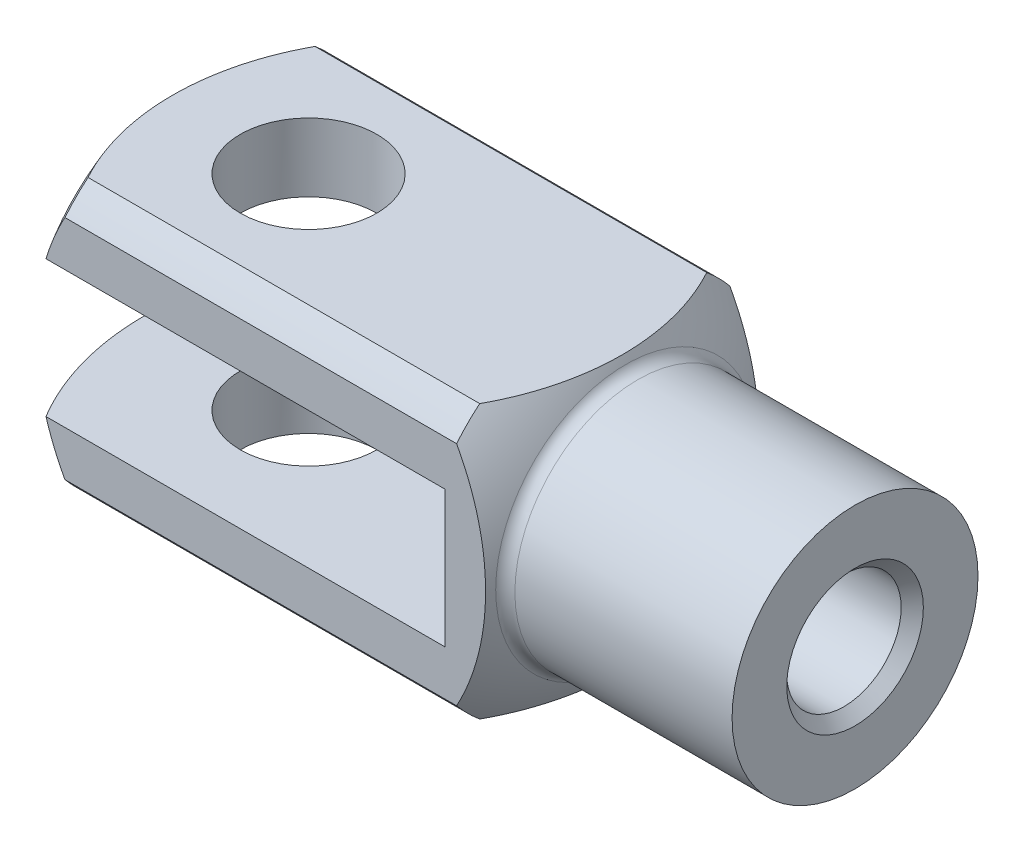
ISO-10303-21;
HEADER;
FILE_DESCRIPTION(('STEP AP214'),'2;1');
FILE_NAME('part.step','',(''),(''),'','','');
FILE_SCHEMA(('AUTOMOTIVE_DESIGN { 1 0 10303 214 1 1 1 1 }'));
ENDSEC;
DATA;
#1=APPLICATION_CONTEXT('core data for automotive mechanical design processes');
#2=APPLICATION_PROTOCOL_DEFINITION('international standard','automotive_design',2000,#1);
#3=PRODUCT_CONTEXT('',#1,'mechanical');
#4=PRODUCT('Part','Part','',(#3));
#5=PRODUCT_RELATED_PRODUCT_CATEGORY('part','',(#4));
#6=PRODUCT_DEFINITION_FORMATION('','',#4);
#7=PRODUCT_DEFINITION_CONTEXT('part definition',#1,'design');
#8=PRODUCT_DEFINITION('design','',#6,#7);
#9=PRODUCT_DEFINITION_SHAPE('','',#8);
#10=(LENGTH_UNIT() NAMED_UNIT(*) SI_UNIT(.MILLI.,.METRE.));
#11=(NAMED_UNIT(*) PLANE_ANGLE_UNIT() SI_UNIT($,.RADIAN.));
#12=(NAMED_UNIT(*) SI_UNIT($,.STERADIAN.) SOLID_ANGLE_UNIT());
#13=UNCERTAINTY_MEASURE_WITH_UNIT(LENGTH_MEASURE(1.E-05),#10,'distance_accuracy_value','');
#14=(GEOMETRIC_REPRESENTATION_CONTEXT(3) GLOBAL_UNCERTAINTY_ASSIGNED_CONTEXT((#13)) GLOBAL_UNIT_ASSIGNED_CONTEXT((#10,
#11,#12)) REPRESENTATION_CONTEXT('',''));
#15=CARTESIAN_POINT('',(0.,0.,0.));
#16=DIRECTION('',(0.,0.,1.));
#17=DIRECTION('',(1.,0.,0.));
#18=AXIS2_PLACEMENT_3D('',#15,#16,#17);
#19=CARTESIAN_POINT('',(-63.9,20.,-10.));
#20=DIRECTION('',(0.,0.,-1.));
#21=DIRECTION('',(-1.,0.,0.));
#22=AXIS2_PLACEMENT_3D('',#19,#20,#21);
#23=PLANE('',#22);
#24=DIRECTION('',(-1.,0.,0.));
#25=VECTOR('',#24,1.);
#26=CARTESIAN_POINT('',(20.,-5.,-10.));
#27=LINE('',#26,#25);
#28=CARTESIAN_POINT('',(20.,-5.,-10.));
#29=VERTEX_POINT('',#28);
#30=CARTESIAN_POINT('',(-9.21820722073961,-5.,-10.));
#31=VERTEX_POINT('',#30);
#32=EDGE_CURVE('E168',#29,#31,#27,.T.);
#33=ORIENTED_EDGE('',*,*,#32,.F.);
#34=DIRECTION('',(0.,-1.,0.));
#35=VECTOR('',#34,1.);
#36=CARTESIAN_POINT('',(20.,5.,-10.));
#37=LINE('',#36,#35);
#38=CARTESIAN_POINT('',(20.,5.,-10.));
#39=VERTEX_POINT('',#38);
#40=EDGE_CURVE('E152',#39,#29,#37,.T.);
#41=ORIENTED_EDGE('',*,*,#40,.F.);
#42=DIRECTION('',(-1.,0.,0.));
#43=VECTOR('',#42,1.);
#44=CARTESIAN_POINT('',(20.,5.,-10.));
#45=LINE('',#44,#43);
#46=CARTESIAN_POINT('',(-9.21820722073961,5.,-10.));
#47=VERTEX_POINT('',#46);
#48=EDGE_CURVE('E149',#39,#47,#45,.T.);
#49=ORIENTED_EDGE('',*,*,#48,.T.);
#50=CARTESIAN_POINT('',(7.36491673103307,1.37997252513955E-12,-10.));
#51=DIRECTION('',(0.,0.,1.));
#52=DIRECTION('',(-1.,0.,0.));
#53=AXIS2_PLACEMENT_3D('',#50,#51,#52);
#54=CIRCLE('',#53,17.3205080756842);
#55=CARTESIAN_POINT('',(-7.8337674225336,8.30662386291768,-10.));
#56=VERTEX_POINT('',#55);
#57=EDGE_CURVE('E880',#56,#47,#54,.T.);
#58=ORIENTED_EDGE('',*,*,#57,.F.);
#59=DIRECTION('',(1.,0.,0.));
#60=VECTOR('',#59,1.);
#61=CARTESIAN_POINT('',(40.,8.30662386291807,-10.));
#62=LINE('',#61,#60);
#63=CARTESIAN_POINT('',(20.833767422534,8.30662386291807,-10.));
#64=VERTEX_POINT('',#63);
#65=EDGE_CURVE('E1015',#56,#64,#62,.T.);
#66=ORIENTED_EDGE('',*,*,#65,.T.);
#67=CARTESIAN_POINT('',(5.63508326887225,-6.27987245538364E-11,-10.));
#68=DIRECTION('',(0.,0.,1.));
#69=DIRECTION('',(-1.,0.,0.));
#70=AXIS2_PLACEMENT_3D('',#67,#68,#69);
#71=CIRCLE('',#70,17.3205080758158);
#72=CARTESIAN_POINT('',(20.833767422534,-8.30662386291807,-10.));
#73=VERTEX_POINT('',#72);
#74=EDGE_CURVE('E440',#73,#64,#71,.T.);
#75=ORIENTED_EDGE('',*,*,#74,.F.);
#76=DIRECTION('',(-1.,0.,0.));
#77=VECTOR('',#76,1.);
#78=CARTESIAN_POINT('',(40.,-8.30662386291807,-10.));
#79=LINE('',#78,#77);
#80=CARTESIAN_POINT('',(-7.8337674225336,-8.3066238629163,-10.));
#81=VERTEX_POINT('',#80);
#82=EDGE_CURVE('E191',#73,#81,#79,.T.);
#83=ORIENTED_EDGE('',*,*,#82,.T.);
#84=EDGE_CURVE('E79',#31,#81,#54,.T.);
#85=ORIENTED_EDGE('',*,*,#84,.F.);
#86=EDGE_LOOP('',(#33,#41,#49,#58,#66,#75,#83,#85));
#87=FACE_BOUND('',#86,.T.);
#88=ADVANCED_FACE('F56',(#87),#23,.T.);
#89=CARTESIAN_POINT('',(40.,20.,10.));
#90=DIRECTION('',(0.,0.,1.));
#91=DIRECTION('',(1.,0.,0.));
#92=AXIS2_PLACEMENT_3D('',#89,#90,#91);
#93=PLANE('',#92);
#94=DIRECTION('',(-1.,0.,0.));
#95=VECTOR('',#94,1.);
#96=CARTESIAN_POINT('',(20.,-5.,10.));
#97=LINE('',#96,#95);
#98=CARTESIAN_POINT('',(20.,-5.,10.));
#99=VERTEX_POINT('',#98);
#100=CARTESIAN_POINT('',(-9.21820722073961,-5.,10.));
#101=VERTEX_POINT('',#100);
#102=EDGE_CURVE('E180',#99,#101,#97,.T.);
#103=ORIENTED_EDGE('',*,*,#102,.T.);
#104=CARTESIAN_POINT('',(7.36491673103307,1.37997252513955E-12,10.));
#105=DIRECTION('',(0.,0.,-1.));
#106=DIRECTION('',(1.,0.,0.));
#107=AXIS2_PLACEMENT_3D('',#104,#105,#106);
#108=CIRCLE('',#107,17.3205080756842);
#109=CARTESIAN_POINT('',(-7.8337674225336,-8.3066238629163,10.));
#110=VERTEX_POINT('',#109);
#111=EDGE_CURVE('E908',#110,#101,#108,.T.);
#112=ORIENTED_EDGE('',*,*,#111,.F.);
#113=DIRECTION('',(1.,0.,0.));
#114=VECTOR('',#113,1.);
#115=CARTESIAN_POINT('',(40.,-8.30662386291807,10.));
#116=LINE('',#115,#114);
#117=CARTESIAN_POINT('',(20.833767422534,-8.30662386291807,10.));
#118=VERTEX_POINT('',#117);
#119=EDGE_CURVE('E318',#110,#118,#116,.T.);
#120=ORIENTED_EDGE('',*,*,#119,.T.);
#121=CARTESIAN_POINT('',(5.63508326887225,-6.27987245538364E-11,10.));
#122=DIRECTION('',(0.,0.,-1.));
#123=DIRECTION('',(1.,0.,0.));
#124=AXIS2_PLACEMENT_3D('',#121,#122,#123);
#125=CIRCLE('',#124,17.3205080758158);
#126=CARTESIAN_POINT('',(20.833767422534,8.30662386291807,10.));
#127=VERTEX_POINT('',#126);
#128=EDGE_CURVE('E417',#127,#118,#125,.T.);
#129=ORIENTED_EDGE('',*,*,#128,.F.);
#130=DIRECTION('',(-1.,0.,0.));
#131=VECTOR('',#130,1.);
#132=CARTESIAN_POINT('',(40.,8.30662386291807,10.));
#133=LINE('',#132,#131);
#134=CARTESIAN_POINT('',(-7.8337674225336,8.30662386291768,10.));
#135=VERTEX_POINT('',#134);
#136=EDGE_CURVE('E1043',#127,#135,#133,.T.);
#137=ORIENTED_EDGE('',*,*,#136,.T.);
#138=CARTESIAN_POINT('',(-9.21820722073962,5.,10.));
#139=VERTEX_POINT('',#138);
#140=EDGE_CURVE('E166',#139,#135,#108,.T.);
#141=ORIENTED_EDGE('',*,*,#140,.F.);
#142=DIRECTION('',(-1.,0.,0.));
#143=VECTOR('',#142,1.);
#144=CARTESIAN_POINT('',(20.,5.,10.));
#145=LINE('',#144,#143);
#146=CARTESIAN_POINT('',(20.,5.,10.));
#147=VERTEX_POINT('',#146);
#148=EDGE_CURVE('E71',#147,#139,#145,.T.);
#149=ORIENTED_EDGE('',*,*,#148,.F.);
#150=DIRECTION('',(0.,1.,0.));
#151=VECTOR('',#150,1.);
#152=CARTESIAN_POINT('',(20.,-5.,10.));
#153=LINE('',#152,#151);
#154=EDGE_CURVE('E153',#99,#147,#153,.T.);
#155=ORIENTED_EDGE('',*,*,#154,.F.);
#156=EDGE_LOOP('',(#103,#112,#120,#129,#137,#141,#149,#155));
#157=FACE_BOUND('',#156,.T.);
#158=ADVANCED_FACE('F164',(#157),#93,.T.);
#159=CARTESIAN_POINT('',(7.36491673103307,1.37997252513955E-12,0.));
#160=DIRECTION('',(1.,0.,0.));
#161=DIRECTION('',(0.,-1.,0.));
#162=AXIS2_PLACEMENT_3D('',#159,#160,#161);
#163=SPHERICAL_SURFACE('',#162,19.999999999996);
#164=ORIENTED_EDGE('',*,*,#111,.T.);
#165=CARTESIAN_POINT('',(7.36491673103307,-5.,0.));
#166=DIRECTION('',(0.,-1.,0.));
#167=DIRECTION('',(0.,0.,1.));
#168=AXIS2_PLACEMENT_3D('',#165,#166,#167);
#169=CIRCLE('',#168,19.3649167310327);
#170=EDGE_CURVE('E294',#101,#31,#169,.T.);
#171=ORIENTED_EDGE('',*,*,#170,.T.);
#172=ORIENTED_EDGE('',*,*,#84,.T.);
#173=CARTESIAN_POINT('',(-7.8337674225336,0.,0.));
#174=DIRECTION('',(1.,0.,0.));
#175=DIRECTION('',(0.,0.,-1.));
#176=AXIS2_PLACEMENT_3D('',#173,#174,#175);
#177=CIRCLE('',#176,13.);
#178=CARTESIAN_POINT('',(-7.8337674225336,-10.,-8.30662386291807));
#179=VERTEX_POINT('',#178);
#180=EDGE_CURVE('E943',#179,#81,#177,.T.);
#181=ORIENTED_EDGE('',*,*,#180,.F.);
#182=CARTESIAN_POINT('',(7.36491673103307,-10.,0.));
#183=DIRECTION('',(0.,1.,0.));
#184=DIRECTION('',(0.,0.,-1.));
#185=AXIS2_PLACEMENT_3D('',#182,#183,#184);
#186=CIRCLE('',#185,17.3205080756835);
#187=CARTESIAN_POINT('',(-7.8337674225336,-10.,8.30662386291807));
#188=VERTEX_POINT('',#187);
#189=EDGE_CURVE('E953',#179,#188,#186,.T.);
#190=ORIENTED_EDGE('',*,*,#189,.T.);
#191=CARTESIAN_POINT('',(-7.8337674225336,0.,0.));
#192=DIRECTION('',(1.,0.,0.));
#193=DIRECTION('',(0.,0.,-1.));
#194=AXIS2_PLACEMENT_3D('',#191,#192,#193);
#195=CIRCLE('',#194,13.);
#196=EDGE_CURVE('E910',#110,#188,#195,.T.);
#197=ORIENTED_EDGE('',*,*,#196,.F.);
#198=EDGE_LOOP('',(#164,#171,#172,#181,#190,#197));
#199=FACE_BOUND('',#198,.T.);
#200=ADVANCED_FACE('F219',(#199),#163,.T.);
#201=ORIENTED_EDGE('',*,*,#57,.T.);
#202=CARTESIAN_POINT('',(7.36491673103307,5.,0.));
#203=DIRECTION('',(0.,1.,0.));
#204=DIRECTION('',(0.,0.,-1.));
#205=AXIS2_PLACEMENT_3D('',#202,#203,#204);
#206=CIRCLE('',#205,19.3649167310334);
#207=EDGE_CURVE('E184',#47,#139,#206,.T.);
#208=ORIENTED_EDGE('',*,*,#207,.T.);
#209=ORIENTED_EDGE('',*,*,#140,.T.);
#210=CARTESIAN_POINT('',(-7.8337674225336,0.,0.));
#211=DIRECTION('',(1.,0.,0.));
#212=DIRECTION('',(0.,0.,-1.));
#213=AXIS2_PLACEMENT_3D('',#210,#211,#212);
#214=CIRCLE('',#213,13.);
#215=CARTESIAN_POINT('',(-7.8337674225336,10.,8.30662386291807));
#216=VERTEX_POINT('',#215);
#217=EDGE_CURVE('E317',#216,#135,#214,.T.);
#218=ORIENTED_EDGE('',*,*,#217,.F.);
#219=CARTESIAN_POINT('',(7.36491673103307,10.,0.));
#220=DIRECTION('',(0.,-1.,0.));
#221=DIRECTION('',(0.,0.,1.));
#222=AXIS2_PLACEMENT_3D('',#219,#220,#221);
#223=CIRCLE('',#222,17.3205080756851);
#224=CARTESIAN_POINT('',(-7.8337674225336,10.,-8.30662386291807));
#225=VERTEX_POINT('',#224);
#226=EDGE_CURVE('E330',#216,#225,#223,.T.);
#227=ORIENTED_EDGE('',*,*,#226,.T.);
#228=CARTESIAN_POINT('',(-7.8337674225336,0.,0.));
#229=DIRECTION('',(1.,0.,0.));
#230=DIRECTION('',(0.,0.,-1.));
#231=AXIS2_PLACEMENT_3D('',#228,#229,#230);
#232=CIRCLE('',#231,13.);
#233=EDGE_CURVE('E341',#56,#225,#232,.T.);
#234=ORIENTED_EDGE('',*,*,#233,.F.);
#235=EDGE_LOOP('',(#201,#208,#209,#218,#227,#234));
#236=FACE_BOUND('',#235,.T.);
#237=ADVANCED_FACE('F230',(#236),#163,.T.);
#238=CARTESIAN_POINT('',(5.63508326887225,-6.27987245538364E-11,0.));
#239=DIRECTION('',(1.,0.,0.));
#240=DIRECTION('',(0.,0.,-1.));
#241=AXIS2_PLACEMENT_3D('',#238,#239,#240);
#242=SPHERICAL_SURFACE('',#241,20.0000000001101);
#243=CARTESIAN_POINT('',(23.2219264238721,-6.27987245538364E-11,0.));
#244=DIRECTION('',(-1.,0.,0.));
#245=DIRECTION('',(0.,0.,1.));
#246=AXIS2_PLACEMENT_3D('',#243,#244,#245);
#247=CIRCLE('',#246,9.52380952381113);
#248=CARTESIAN_POINT('',(23.2219264238721,-6.27987245538364E-11,9.52380952381113));
#249=VERTEX_POINT('',#248);
#250=EDGE_CURVE('E13',#249,#249,#247,.T.);
#251=ORIENTED_EDGE('',*,*,#250,.T.);
#252=EDGE_LOOP('',(#251));
#253=FACE_BOUND('',#252,.T.);
#254=CARTESIAN_POINT('',(20.833767422534,0.,0.));
#255=DIRECTION('',(1.,0.,0.));
#256=DIRECTION('',(0.,0.,-1.));
#257=AXIS2_PLACEMENT_3D('',#254,#255,#256);
#258=CIRCLE('',#257,13.);
#259=CARTESIAN_POINT('',(20.833767422534,10.,-8.30662386292942));
#260=VERTEX_POINT('',#259);
#261=EDGE_CURVE('E352',#64,#260,#258,.T.);
#262=ORIENTED_EDGE('',*,*,#261,.T.);
#263=CARTESIAN_POINT('',(5.63508326887225,10.,0.));
#264=DIRECTION('',(0.,-1.,0.));
#265=DIRECTION('',(0.,0.,1.));
#266=AXIS2_PLACEMENT_3D('',#263,#264,#265);
#267=CIRCLE('',#266,17.3205080757796);
#268=CARTESIAN_POINT('',(20.833767422534,10.,8.30662386292942));
#269=VERTEX_POINT('',#268);
#270=EDGE_CURVE('E390',#260,#269,#267,.T.);
#271=ORIENTED_EDGE('',*,*,#270,.T.);
#272=CARTESIAN_POINT('',(20.833767422534,0.,0.));
#273=DIRECTION('',(1.,0.,0.));
#274=DIRECTION('',(0.,0.,-1.));
#275=AXIS2_PLACEMENT_3D('',#272,#273,#274);
#276=CIRCLE('',#275,13.);
#277=EDGE_CURVE('E402',#269,#127,#276,.T.);
#278=ORIENTED_EDGE('',*,*,#277,.T.);
#279=ORIENTED_EDGE('',*,*,#128,.T.);
#280=CARTESIAN_POINT('',(20.833767422534,0.,0.));
#281=DIRECTION('',(1.,0.,0.));
#282=DIRECTION('',(0.,0.,-1.));
#283=AXIS2_PLACEMENT_3D('',#280,#281,#282);
#284=CIRCLE('',#283,13.);
#285=CARTESIAN_POINT('',(20.833767422534,-10.,8.30662386300502));
#286=VERTEX_POINT('',#285);
#287=EDGE_CURVE('E416',#118,#286,#284,.T.);
#288=ORIENTED_EDGE('',*,*,#287,.T.);
#289=CARTESIAN_POINT('',(5.63508326887225,-10.,0.));
#290=DIRECTION('',(0.,1.,0.));
#291=DIRECTION('',(0.,0.,-1.));
#292=AXIS2_PLACEMENT_3D('',#289,#290,#291);
#293=CIRCLE('',#292,17.3205080758521);
#294=CARTESIAN_POINT('',(20.833767422534,-10.,-8.30662386300502));
#295=VERTEX_POINT('',#294);
#296=EDGE_CURVE('E428',#286,#295,#293,.T.);
#297=ORIENTED_EDGE('',*,*,#296,.T.);
#298=CARTESIAN_POINT('',(20.833767422534,0.,0.));
#299=DIRECTION('',(1.,0.,0.));
#300=DIRECTION('',(0.,0.,-1.));
#301=AXIS2_PLACEMENT_3D('',#298,#299,#300);
#302=CIRCLE('',#301,13.);
#303=EDGE_CURVE('E354',#295,#73,#302,.T.);
#304=ORIENTED_EDGE('',*,*,#303,.T.);
#305=ORIENTED_EDGE('',*,*,#74,.T.);
#306=EDGE_LOOP('',(#262,#271,#278,#279,#288,#297,#304,#305));
#307=FACE_BOUND('',#306,.T.);
#308=ADVANCED_FACE('F223',(#253,#307),#242,.T.);
#309=CARTESIAN_POINT('',(40.,-10.,20.));
#310=DIRECTION('',(0.,-1.,0.));
#311=DIRECTION('',(0.,0.,-1.));
#312=AXIS2_PLACEMENT_3D('',#309,#310,#311);
#313=PLANE('',#312);
#314=CARTESIAN_POINT('',(0.,-10.,0.));
#315=DIRECTION('',(0.,-1.,0.));
#316=DIRECTION('',(0.,0.,-1.));
#317=AXIS2_PLACEMENT_3D('',#314,#315,#316);
#318=CIRCLE('',#317,5.);
#319=CARTESIAN_POINT('',(0.,-10.,-5.));
#320=VERTEX_POINT('',#319);
#321=EDGE_CURVE('E282',#320,#320,#318,.T.);
#322=ORIENTED_EDGE('',*,*,#321,.F.);
#323=EDGE_LOOP('',(#322));
#324=FACE_BOUND('',#323,.T.);
#325=DIRECTION('',(1.,0.,0.));
#326=VECTOR('',#325,1.);
#327=CARTESIAN_POINT('',(40.,-10.,-8.30662386291807));
#328=LINE('',#327,#326);
#329=EDGE_CURVE('E453',#179,#295,#328,.T.);
#330=ORIENTED_EDGE('',*,*,#329,.T.);
#331=ORIENTED_EDGE('',*,*,#296,.F.);
#332=DIRECTION('',(-1.,0.,0.));
#333=VECTOR('',#332,1.);
#334=CARTESIAN_POINT('',(40.,-10.,8.30662386291807));
#335=LINE('',#334,#333);
#336=EDGE_CURVE('E954',#286,#188,#335,.T.);
#337=ORIENTED_EDGE('',*,*,#336,.T.);
#338=ORIENTED_EDGE('',*,*,#189,.F.);
#339=EDGE_LOOP('',(#330,#331,#337,#338));
#340=FACE_BOUND('',#339,.T.);
#341=ADVANCED_FACE('F229',(#324,#340),#313,.T.);
#342=CARTESIAN_POINT('',(40.,0.,0.));
#343=DIRECTION('',(1.,0.,0.));
#344=DIRECTION('',(0.,0.70710678118651,0.707106781186585));
#345=AXIS2_PLACEMENT_3D('',#342,#343,#344);
#346=CYLINDRICAL_SURFACE('',#345,13.);
#347=ORIENTED_EDGE('',*,*,#82,.F.);
#348=ORIENTED_EDGE('',*,*,#303,.F.);
#349=ORIENTED_EDGE('',*,*,#329,.F.);
#350=ORIENTED_EDGE('',*,*,#180,.T.);
#351=EDGE_LOOP('',(#347,#348,#349,#350));
#352=FACE_BOUND('',#351,.T.);
#353=ADVANCED_FACE('F234',(#352),#346,.T.);
#354=CARTESIAN_POINT('',(40.,0.,0.));
#355=DIRECTION('',(1.,0.,0.));
#356=DIRECTION('',(0.,0.70710678118651,-0.707106781186585));
#357=AXIS2_PLACEMENT_3D('',#354,#355,#356);
#358=CYLINDRICAL_SURFACE('',#357,13.);
#359=ORIENTED_EDGE('',*,*,#119,.F.);
#360=ORIENTED_EDGE('',*,*,#196,.T.);
#361=ORIENTED_EDGE('',*,*,#336,.F.);
#362=ORIENTED_EDGE('',*,*,#287,.F.);
#363=EDGE_LOOP('',(#359,#360,#361,#362));
#364=FACE_BOUND('',#363,.T.);
#365=ADVANCED_FACE('F237',(#364),#358,.T.);
#366=CARTESIAN_POINT('',(40.,0.,0.));
#367=DIRECTION('',(1.,0.,0.));
#368=DIRECTION('',(0.,-0.707106781186539,0.707106781186556));
#369=AXIS2_PLACEMENT_3D('',#366,#367,#368);
#370=CYLINDRICAL_SURFACE('',#369,13.);
#371=ORIENTED_EDGE('',*,*,#65,.F.);
#372=ORIENTED_EDGE('',*,*,#233,.T.);
#373=DIRECTION('',(-1.,0.,0.));
#374=VECTOR('',#373,1.);
#375=CARTESIAN_POINT('',(40.,10.,-8.30662386291807));
#376=LINE('',#375,#374);
#377=EDGE_CURVE('E969',#260,#225,#376,.T.);
#378=ORIENTED_EDGE('',*,*,#377,.F.);
#379=ORIENTED_EDGE('',*,*,#261,.F.);
#380=EDGE_LOOP('',(#371,#372,#378,#379));
#381=FACE_BOUND('',#380,.T.);
#382=ADVANCED_FACE('F242',(#381),#370,.T.);
#383=CARTESIAN_POINT('',(-20.,10.,20.));
#384=DIRECTION('',(0.,1.,0.));
#385=DIRECTION('',(0.,0.,1.));
#386=AXIS2_PLACEMENT_3D('',#383,#384,#385);
#387=PLANE('',#386);
#388=CARTESIAN_POINT('',(0.,10.,0.));
#389=DIRECTION('',(0.,1.,0.));
#390=DIRECTION('',(0.,0.,1.));
#391=AXIS2_PLACEMENT_3D('',#388,#389,#390);
#392=CIRCLE('',#391,5.);
#393=CARTESIAN_POINT('',(0.,10.,5.));
#394=VERTEX_POINT('',#393);
#395=EDGE_CURVE('E287',#394,#394,#392,.T.);
#396=ORIENTED_EDGE('',*,*,#395,.F.);
#397=EDGE_LOOP('',(#396));
#398=FACE_BOUND('',#397,.T.);
#399=DIRECTION('',(1.,0.,0.));
#400=VECTOR('',#399,1.);
#401=CARTESIAN_POINT('',(40.,10.,8.30662386291807));
#402=LINE('',#401,#400);
#403=EDGE_CURVE('E932',#216,#269,#402,.T.);
#404=ORIENTED_EDGE('',*,*,#403,.T.);
#405=ORIENTED_EDGE('',*,*,#270,.F.);
#406=ORIENTED_EDGE('',*,*,#377,.T.);
#407=ORIENTED_EDGE('',*,*,#226,.F.);
#408=EDGE_LOOP('',(#404,#405,#406,#407));
#409=FACE_BOUND('',#408,.T.);
#410=ADVANCED_FACE('F248',(#398,#409),#387,.T.);
#411=CARTESIAN_POINT('',(40.,0.,0.));
#412=DIRECTION('',(1.,0.,0.));
#413=DIRECTION('',(0.,-0.70710678118654,-0.707106781186555));
#414=AXIS2_PLACEMENT_3D('',#411,#412,#413);
#415=CYLINDRICAL_SURFACE('',#414,13.);
#416=ORIENTED_EDGE('',*,*,#136,.F.);
#417=ORIENTED_EDGE('',*,*,#277,.F.);
#418=ORIENTED_EDGE('',*,*,#403,.F.);
#419=ORIENTED_EDGE('',*,*,#217,.T.);
#420=EDGE_LOOP('',(#416,#417,#418,#419));
#421=FACE_BOUND('',#420,.T.);
#422=ADVANCED_FACE('F252',(#421),#415,.T.);
#423=CARTESIAN_POINT('',(-20.,-5.,20.));
#424=DIRECTION('',(0.,1.,0.));
#425=DIRECTION('',(0.,0.,1.));
#426=AXIS2_PLACEMENT_3D('',#423,#424,#425);
#427=PLANE('',#426);
#428=CARTESIAN_POINT('',(0.,-5.,0.));
#429=DIRECTION('',(0.,1.,0.));
#430=DIRECTION('',(0.,0.,1.));
#431=AXIS2_PLACEMENT_3D('',#428,#429,#430);
#432=CIRCLE('',#431,5.);
#433=CARTESIAN_POINT('',(0.,-5.,5.));
#434=VERTEX_POINT('',#433);
#435=EDGE_CURVE('E1489',#434,#434,#432,.T.);
#436=ORIENTED_EDGE('',*,*,#435,.F.);
#437=EDGE_LOOP('',(#436));
#438=FACE_BOUND('',#437,.T.);
#439=ORIENTED_EDGE('',*,*,#170,.F.);
#440=ORIENTED_EDGE('',*,*,#102,.F.);
#441=DIRECTION('',(0.,0.,1.));
#442=VECTOR('',#441,1.);
#443=CARTESIAN_POINT('',(20.,-5.,-10.));
#444=LINE('',#443,#442);
#445=EDGE_CURVE('E159',#29,#99,#444,.T.);
#446=ORIENTED_EDGE('',*,*,#445,.F.);
#447=ORIENTED_EDGE('',*,*,#32,.T.);
#448=EDGE_LOOP('',(#439,#440,#446,#447));
#449=FACE_BOUND('',#448,.T.);
#450=ADVANCED_FACE('F256',(#438,#449),#427,.T.);
#451=CARTESIAN_POINT('',(20.,5.,20.));
#452=DIRECTION('',(0.,-1.,0.));
#453=DIRECTION('',(0.,0.,-1.));
#454=AXIS2_PLACEMENT_3D('',#451,#452,#453);
#455=PLANE('',#454);
#456=CARTESIAN_POINT('',(0.,5.,0.));
#457=DIRECTION('',(0.,-1.,0.));
#458=DIRECTION('',(0.,0.,-1.));
#459=AXIS2_PLACEMENT_3D('',#456,#457,#458);
#460=CIRCLE('',#459,5.);
#461=CARTESIAN_POINT('',(0.,5.,-5.));
#462=VERTEX_POINT('',#461);
#463=EDGE_CURVE('E1490',#462,#462,#460,.T.);
#464=ORIENTED_EDGE('',*,*,#463,.F.);
#465=EDGE_LOOP('',(#464));
#466=FACE_BOUND('',#465,.T.);
#467=ORIENTED_EDGE('',*,*,#207,.F.);
#468=ORIENTED_EDGE('',*,*,#48,.F.);
#469=DIRECTION('',(0.,0.,-1.));
#470=VECTOR('',#469,1.);
#471=CARTESIAN_POINT('',(20.,5.,10.));
#472=LINE('',#471,#470);
#473=EDGE_CURVE('E146',#147,#39,#472,.T.);
#474=ORIENTED_EDGE('',*,*,#473,.F.);
#475=ORIENTED_EDGE('',*,*,#148,.T.);
#476=EDGE_LOOP('',(#467,#468,#474,#475));
#477=FACE_BOUND('',#476,.T.);
#478=ADVANCED_FACE('F148',(#466,#477),#455,.T.);
#479=CARTESIAN_POINT('',(20.,0.,0.));
#480=DIRECTION('',(-1.,0.,0.));
#481=DIRECTION('',(0.,0.,1.));
#482=AXIS2_PLACEMENT_3D('',#479,#480,#481);
#483=PLANE('',#482);
#484=CARTESIAN_POINT('',(20.,0.,0.));
#485=DIRECTION('',(-1.,0.,0.));
#486=DIRECTION('',(0.,0.,1.));
#487=AXIS2_PLACEMENT_3D('',#484,#485,#486);
#488=CIRCLE('',#487,4.18800000000001);
#489=CARTESIAN_POINT('',(20.,0.,4.18800000000001));
#490=VERTEX_POINT('',#489);
#491=EDGE_CURVE('E281',#490,#490,#488,.T.);
#492=ORIENTED_EDGE('',*,*,#491,.F.);
#493=EDGE_LOOP('',(#492));
#494=FACE_BOUND('',#493,.T.);
#495=ORIENTED_EDGE('',*,*,#154,.T.);
#496=ORIENTED_EDGE('',*,*,#473,.T.);
#497=ORIENTED_EDGE('',*,*,#40,.T.);
#498=ORIENTED_EDGE('',*,*,#445,.T.);
#499=EDGE_LOOP('',(#495,#496,#497,#498));
#500=FACE_BOUND('',#499,.T.);
#501=ADVANCED_FACE('F157',(#494,#500),#483,.T.);
#502=CARTESIAN_POINT('',(40.,0.,0.));
#503=DIRECTION('',(-1.,0.,0.));
#504=DIRECTION('',(0.,0.,1.));
#505=AXIS2_PLACEMENT_3D('',#502,#503,#504);
#506=CYLINDRICAL_SURFACE('',#505,9.);
#507=CARTESIAN_POINT('',(24.1012685816157,0.,0.));
#508=DIRECTION('',(-1.,0.,0.));
#509=DIRECTION('',(0.,0.,1.));
#510=AXIS2_PLACEMENT_3D('',#507,#508,#509);
#511=CIRCLE('',#510,9.);
#512=CARTESIAN_POINT('',(24.1012685816157,0.,9.));
#513=VERTEX_POINT('',#512);
#514=EDGE_CURVE('E64',#513,#513,#511,.F.);
#515=ORIENTED_EDGE('',*,*,#514,.T.);
#516=EDGE_LOOP('',(#515));
#517=FACE_BOUND('',#516,.T.);
#518=CARTESIAN_POINT('',(40.,0.,0.));
#519=DIRECTION('',(1.,0.,0.));
#520=DIRECTION('',(0.,0.,-1.));
#521=AXIS2_PLACEMENT_3D('',#518,#519,#520);
#522=CIRCLE('',#521,9.);
#523=CARTESIAN_POINT('',(40.,0.,-9.));
#524=VERTEX_POINT('',#523);
#525=EDGE_CURVE('E161',#524,#524,#522,.T.);
#526=ORIENTED_EDGE('',*,*,#525,.F.);
#527=EDGE_LOOP('',(#526));
#528=FACE_BOUND('',#527,.T.);
#529=ADVANCED_FACE('F196',(#517,#528),#506,.T.);
#530=CARTESIAN_POINT('',(40.,0.,0.));
#531=DIRECTION('',(1.,0.,0.));
#532=DIRECTION('',(0.,0.,-1.));
#533=AXIS2_PLACEMENT_3D('',#530,#531,#532);
#534=PLANE('',#533);
#535=CARTESIAN_POINT('',(40.,0.,0.));
#536=DIRECTION('',(1.,0.,0.));
#537=DIRECTION('',(0.,0.,-1.));
#538=AXIS2_PLACEMENT_3D('',#535,#536,#537);
#539=CIRCLE('',#538,5.00000000000002);
#540=CARTESIAN_POINT('',(40.,0.,-5.00000000000002));
#541=VERTEX_POINT('',#540);
#542=EDGE_CURVE('E190',#541,#541,#539,.F.);
#543=ORIENTED_EDGE('',*,*,#542,.T.);
#544=EDGE_LOOP('',(#543));
#545=FACE_BOUND('',#544,.T.);
#546=ORIENTED_EDGE('',*,*,#525,.T.);
#547=EDGE_LOOP('',(#546));
#548=FACE_BOUND('',#547,.T.);
#549=ADVANCED_FACE('F269',(#545,#548),#534,.T.);
#550=CARTESIAN_POINT('',(20.,0.,0.));
#551=DIRECTION('',(-1.,0.,0.));
#552=DIRECTION('',(0.,0.,1.));
#553=AXIS2_PLACEMENT_3D('',#550,#551,#552);
#554=CYLINDRICAL_SURFACE('',#553,4.18800000000001);
#555=CARTESIAN_POINT('',(39.188,0.,0.));
#556=DIRECTION('',(1.,0.,0.));
#557=DIRECTION('',(0.,0.,-1.));
#558=AXIS2_PLACEMENT_3D('',#555,#556,#557);
#559=CIRCLE('',#558,4.18800000000001);
#560=CARTESIAN_POINT('',(39.188,0.,-4.18800000000001));
#561=VERTEX_POINT('',#560);
#562=EDGE_CURVE('E187',#561,#561,#559,.T.);
#563=ORIENTED_EDGE('',*,*,#562,.T.);
#564=EDGE_LOOP('',(#563));
#565=FACE_BOUND('',#564,.T.);
#566=ORIENTED_EDGE('',*,*,#491,.T.);
#567=EDGE_LOOP('',(#566));
#568=FACE_BOUND('',#567,.T.);
#569=ADVANCED_FACE('F210',(#565,#568),#554,.F.);
#570=CARTESIAN_POINT('',(39.188,0.,0.));
#571=DIRECTION('',(1.,0.,0.));
#572=DIRECTION('',(0.,0.,-1.));
#573=AXIS2_PLACEMENT_3D('',#570,#571,#572);
#574=CONICAL_SURFACE('',#573,4.18800000000001,0.785398163397448);
#575=ORIENTED_EDGE('',*,*,#542,.F.);
#576=EDGE_LOOP('',(#575));
#577=FACE_BOUND('',#576,.T.);
#578=ORIENTED_EDGE('',*,*,#562,.F.);
#579=EDGE_LOOP('',(#578));
#580=FACE_BOUND('',#579,.T.);
#581=ADVANCED_FACE('F201',(#577,#580),#574,.F.);
#582=CARTESIAN_POINT('',(24.1012685816157,0.,0.));
#583=DIRECTION('',(-1.,0.,0.));
#584=DIRECTION('',(0.,0.,1.));
#585=AXIS2_PLACEMENT_3D('',#582,#583,#584);
#586=TOROIDAL_SURFACE('',#585,9.99999999999822,0.999999999998224);
#587=ORIENTED_EDGE('',*,*,#250,.F.);
#588=EDGE_LOOP('',(#587));
#589=FACE_BOUND('',#588,.T.);
#590=ORIENTED_EDGE('',*,*,#514,.F.);
#591=EDGE_LOOP('',(#590));
#592=FACE_BOUND('',#591,.T.);
#593=ADVANCED_FACE('F58',(#589,#592),#586,.F.);
#594=CARTESIAN_POINT('',(0.,-10.00003,0.));
#595=DIRECTION('',(0.,1.,0.));
#596=DIRECTION('',(0.,0.,1.));
#597=AXIS2_PLACEMENT_3D('',#594,#595,#596);
#598=CYLINDRICAL_SURFACE('',#597,5.);
#599=ORIENTED_EDGE('',*,*,#395,.T.);
#600=EDGE_LOOP('',(#599));
#601=FACE_BOUND('',#600,.T.);
#602=ORIENTED_EDGE('',*,*,#463,.T.);
#603=EDGE_LOOP('',(#602));
#604=FACE_BOUND('',#603,.T.);
#605=ADVANCED_FACE('F200',(#601,#604),#598,.F.);
#606=ORIENTED_EDGE('',*,*,#321,.T.);
#607=EDGE_LOOP('',(#606));
#608=FACE_BOUND('',#607,.T.);
#609=ORIENTED_EDGE('',*,*,#435,.T.);
#610=EDGE_LOOP('',(#609));
#611=FACE_BOUND('',#610,.T.);
#612=ADVANCED_FACE('F207',(#608,#611),#598,.F.);
#613=CLOSED_SHELL('',(#88,#158,#200,#237,#308,#341,#353,#365,#382,#410,#422,#450,#478,#501,#529,
#549,#569,#581,#593,#605,#612));
#614=MANIFOLD_SOLID_BREP('B2',#613);
#615=ADVANCED_BREP_SHAPE_REPRESENTATION('',(#18,#614),#14);
#616=SHAPE_DEFINITION_REPRESENTATION(#9,#615);
ENDSEC;
END-ISO-10303-21;
